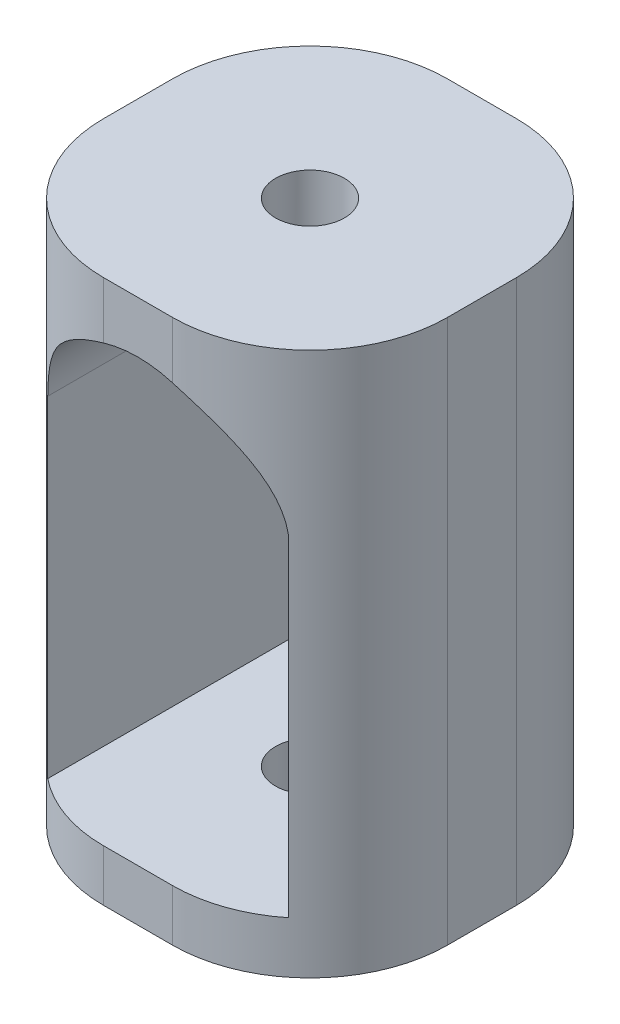
ISO-10303-21;
HEADER;
FILE_DESCRIPTION(('STEP AP214'),'2;1');
FILE_NAME('part.step','',(''),(''),'','','');
FILE_SCHEMA(('AUTOMOTIVE_DESIGN { 1 0 10303 214 1 1 1 1 }'));
ENDSEC;
DATA;
#1=APPLICATION_CONTEXT('core data for automotive mechanical design processes');
#2=APPLICATION_PROTOCOL_DEFINITION('international standard','automotive_design',2000,#1);
#3=PRODUCT_CONTEXT('',#1,'mechanical');
#4=PRODUCT('Part','Part','',(#3));
#5=PRODUCT_RELATED_PRODUCT_CATEGORY('part','',(#4));
#6=PRODUCT_DEFINITION_FORMATION('','',#4);
#7=PRODUCT_DEFINITION_CONTEXT('part definition',#1,'design');
#8=PRODUCT_DEFINITION('design','',#6,#7);
#9=PRODUCT_DEFINITION_SHAPE('','',#8);
#10=(LENGTH_UNIT() NAMED_UNIT(*) SI_UNIT(.MILLI.,.METRE.));
#11=(NAMED_UNIT(*) PLANE_ANGLE_UNIT() SI_UNIT($,.RADIAN.));
#12=(NAMED_UNIT(*) SI_UNIT($,.STERADIAN.) SOLID_ANGLE_UNIT());
#13=UNCERTAINTY_MEASURE_WITH_UNIT(LENGTH_MEASURE(1.E-05),#10,'distance_accuracy_value','');
#14=(GEOMETRIC_REPRESENTATION_CONTEXT(3) GLOBAL_UNCERTAINTY_ASSIGNED_CONTEXT((#13)) GLOBAL_UNIT_ASSIGNED_CONTEXT((#10,
#11,#12)) REPRESENTATION_CONTEXT('',''));
#15=CARTESIAN_POINT('',(0.,0.,0.));
#16=DIRECTION('',(0.,0.,1.));
#17=DIRECTION('',(1.,0.,0.));
#18=AXIS2_PLACEMENT_3D('',#15,#16,#17);
#19=CARTESIAN_POINT('',(0.,30.,20.));
#20=DIRECTION('',(0.,0.,-1.));
#21=DIRECTION('',(-1.,0.,0.));
#22=AXIS2_PLACEMENT_3D('',#19,#20,#21);
#23=PLANE('',#22);
#24=DIRECTION('',(1.,0.,0.));
#25=VECTOR('',#24,1.);
#26=CARTESIAN_POINT('',(0.,30.,20.));
#27=LINE('',#26,#25);
#28=CARTESIAN_POINT('',(-12.,30.,20.));
#29=VERTEX_POINT('',#28);
#30=CARTESIAN_POINT('',(-8.,30.,20.));
#31=VERTEX_POINT('',#30);
#32=EDGE_CURVE('E177',#29,#31,#27,.T.);
#33=ORIENTED_EDGE('',*,*,#32,.F.);
#34=DIRECTION('',(0.,-1.,0.));
#35=VECTOR('',#34,1.);
#36=CARTESIAN_POINT('',(-12.,30.,20.));
#37=LINE('',#36,#35);
#38=CARTESIAN_POINT('',(-12.,26.7096437297509,20.));
#39=VERTEX_POINT('',#38);
#40=EDGE_CURVE('E11',#29,#39,#37,.T.);
#41=ORIENTED_EDGE('',*,*,#40,.T.);
#42=CARTESIAN_POINT('',(-9.99999999999999,19.9667322834646,20.));
#43=DIRECTION('',(0.,0.,1.));
#44=DIRECTION('',(-1.,0.,0.));
#45=AXIS2_PLACEMENT_3D('',#42,#43,#44);
#46=CIRCLE('',#45,7.03326771653543);
#47=CARTESIAN_POINT('',(-8.,26.7096437297509,20.));
#48=VERTEX_POINT('',#47);
#49=EDGE_CURVE('E301',#48,#39,#46,.T.);
#50=ORIENTED_EDGE('',*,*,#49,.F.);
#51=DIRECTION('',(0.,-1.,0.));
#52=VECTOR('',#51,1.);
#53=CARTESIAN_POINT('',(-8.,30.,20.));
#54=LINE('',#53,#52);
#55=EDGE_CURVE('E52',#48,#31,#54,.F.);
#56=ORIENTED_EDGE('',*,*,#55,.T.);
#57=EDGE_LOOP('',(#33,#41,#50,#56));
#58=FACE_BOUND('',#57,.T.);
#59=ADVANCED_FACE('F36',(#58),#23,.F.);
#60=CARTESIAN_POINT('',(0.,30.,0.));
#61=DIRECTION('',(0.,0.,1.));
#62=DIRECTION('',(1.,0.,0.));
#63=AXIS2_PLACEMENT_3D('',#60,#61,#62);
#64=PLANE('',#63);
#65=DIRECTION('',(1.,0.,0.));
#66=VECTOR('',#65,1.);
#67=CARTESIAN_POINT('',(-20.,-1.6,0.));
#68=LINE('',#67,#66);
#69=CARTESIAN_POINT('',(-12.,-1.6,0.));
#70=VERTEX_POINT('',#69);
#71=CARTESIAN_POINT('',(-8.,-1.6,0.));
#72=VERTEX_POINT('',#71);
#73=EDGE_CURVE('E354',#70,#72,#68,.T.);
#74=ORIENTED_EDGE('',*,*,#73,.F.);
#75=DIRECTION('',(0.,-1.,0.));
#76=VECTOR('',#75,1.);
#77=CARTESIAN_POINT('',(-12.,30.,0.));
#78=LINE('',#77,#76);
#79=CARTESIAN_POINT('',(-12.,1.4,0.));
#80=VERTEX_POINT('',#79);
#81=EDGE_CURVE('E195',#70,#80,#78,.F.);
#82=ORIENTED_EDGE('',*,*,#81,.T.);
#83=DIRECTION('',(-1.,0.,0.));
#84=VECTOR('',#83,1.);
#85=CARTESIAN_POINT('',(-17.,1.4,0.));
#86=LINE('',#85,#84);
#87=CARTESIAN_POINT('',(-8.,1.4,0.));
#88=VERTEX_POINT('',#87);
#89=EDGE_CURVE('E339',#88,#80,#86,.T.);
#90=ORIENTED_EDGE('',*,*,#89,.F.);
#91=DIRECTION('',(0.,-1.,0.));
#92=VECTOR('',#91,1.);
#93=CARTESIAN_POINT('',(-8.,30.,0.));
#94=LINE('',#93,#92);
#95=EDGE_CURVE('E188',#88,#72,#94,.T.);
#96=ORIENTED_EDGE('',*,*,#95,.T.);
#97=EDGE_LOOP('',(#74,#82,#90,#96));
#98=FACE_BOUND('',#97,.T.);
#99=ADVANCED_FACE('F272',(#98),#64,.F.);
#100=CARTESIAN_POINT('',(0.,30.,0.));
#101=DIRECTION('',(-1.,0.,0.));
#102=DIRECTION('',(0.,0.,1.));
#103=AXIS2_PLACEMENT_3D('',#100,#101,#102);
#104=PLANE('',#103);
#105=DIRECTION('',(0.,0.,1.));
#106=VECTOR('',#105,1.);
#107=CARTESIAN_POINT('',(0.,-1.6,0.));
#108=LINE('',#107,#106);
#109=CARTESIAN_POINT('',(0.,-1.6,8.));
#110=VERTEX_POINT('',#109);
#111=CARTESIAN_POINT('',(0.,-1.6,12.));
#112=VERTEX_POINT('',#111);
#113=EDGE_CURVE('E351',#110,#112,#108,.T.);
#114=ORIENTED_EDGE('',*,*,#113,.F.);
#115=DIRECTION('',(0.,-1.,0.));
#116=VECTOR('',#115,1.);
#117=CARTESIAN_POINT('',(0.,30.,8.));
#118=LINE('',#117,#116);
#119=CARTESIAN_POINT('',(0.,30.,8.));
#120=VERTEX_POINT('',#119);
#121=EDGE_CURVE('E308',#110,#120,#118,.F.);
#122=ORIENTED_EDGE('',*,*,#121,.T.);
#123=DIRECTION('',(0.,0.,-1.));
#124=VECTOR('',#123,1.);
#125=CARTESIAN_POINT('',(0.,30.,0.));
#126=LINE('',#125,#124);
#127=CARTESIAN_POINT('',(0.,30.,12.));
#128=VERTEX_POINT('',#127);
#129=EDGE_CURVE('E344',#128,#120,#126,.T.);
#130=ORIENTED_EDGE('',*,*,#129,.F.);
#131=DIRECTION('',(0.,-1.,0.));
#132=VECTOR('',#131,1.);
#133=CARTESIAN_POINT('',(0.,30.,12.));
#134=LINE('',#133,#132);
#135=EDGE_CURVE('E310',#128,#112,#134,.T.);
#136=ORIENTED_EDGE('',*,*,#135,.T.);
#137=EDGE_LOOP('',(#114,#122,#130,#136));
#138=FACE_BOUND('',#137,.T.);
#139=ADVANCED_FACE('F278',(#138),#104,.F.);
#140=CARTESIAN_POINT('',(-9.99999999999999,19.9667322834646,0.));
#141=DIRECTION('',(0.,0.,1.));
#142=DIRECTION('',(1.,0.,0.));
#143=AXIS2_PLACEMENT_3D('',#140,#141,#142);
#144=CIRCLE('',#143,7.03326771653543);
#145=CARTESIAN_POINT('',(-12.,26.7096437297509,0.));
#146=VERTEX_POINT('',#145);
#147=CARTESIAN_POINT('',(-8.,26.7096437297509,0.));
#148=VERTEX_POINT('',#147);
#149=EDGE_CURVE('E330',#146,#148,#144,.F.);
#150=ORIENTED_EDGE('',*,*,#149,.F.);
#151=DIRECTION('',(0.,-1.,0.));
#152=VECTOR('',#151,1.);
#153=CARTESIAN_POINT('',(-12.,30.,0.));
#154=LINE('',#153,#152);
#155=CARTESIAN_POINT('',(-12.,30.,0.));
#156=VERTEX_POINT('',#155);
#157=EDGE_CURVE('E193',#146,#156,#154,.F.);
#158=ORIENTED_EDGE('',*,*,#157,.T.);
#159=DIRECTION('',(-1.,0.,0.));
#160=VECTOR('',#159,1.);
#161=CARTESIAN_POINT('',(0.,30.,0.));
#162=LINE('',#161,#160);
#163=CARTESIAN_POINT('',(-8.,30.,0.));
#164=VERTEX_POINT('',#163);
#165=EDGE_CURVE('E343',#164,#156,#162,.T.);
#166=ORIENTED_EDGE('',*,*,#165,.F.);
#167=DIRECTION('',(0.,-1.,0.));
#168=VECTOR('',#167,1.);
#169=CARTESIAN_POINT('',(-8.,30.,0.));
#170=LINE('',#169,#168);
#171=EDGE_CURVE('E190',#164,#148,#170,.T.);
#172=ORIENTED_EDGE('',*,*,#171,.T.);
#173=EDGE_LOOP('',(#150,#158,#166,#172));
#174=FACE_BOUND('',#173,.T.);
#175=ADVANCED_FACE('F281',(#174),#64,.F.);
#176=CARTESIAN_POINT('',(-20.,30.,0.));
#177=DIRECTION('',(1.,0.,0.));
#178=DIRECTION('',(0.,0.,-1.));
#179=AXIS2_PLACEMENT_3D('',#176,#177,#178);
#180=PLANE('',#179);
#181=DIRECTION('',(0.,0.,1.));
#182=VECTOR('',#181,1.);
#183=CARTESIAN_POINT('',(-20.,30.,0.));
#184=LINE('',#183,#182);
#185=CARTESIAN_POINT('',(-20.,30.,8.00000000000001));
#186=VERTEX_POINT('',#185);
#187=CARTESIAN_POINT('',(-20.,30.,12.));
#188=VERTEX_POINT('',#187);
#189=EDGE_CURVE('E180',#186,#188,#184,.T.);
#190=ORIENTED_EDGE('',*,*,#189,.F.);
#191=DIRECTION('',(0.,-1.,0.));
#192=VECTOR('',#191,1.);
#193=CARTESIAN_POINT('',(-20.,30.,8.00000000000001));
#194=LINE('',#193,#192);
#195=CARTESIAN_POINT('',(-20.,-1.6,8.00000000000001));
#196=VERTEX_POINT('',#195);
#197=EDGE_CURVE('E172',#186,#196,#194,.T.);
#198=ORIENTED_EDGE('',*,*,#197,.T.);
#199=DIRECTION('',(0.,0.,-1.));
#200=VECTOR('',#199,1.);
#201=CARTESIAN_POINT('',(-20.,-1.6,20.));
#202=LINE('',#201,#200);
#203=CARTESIAN_POINT('',(-20.,-1.6,12.));
#204=VERTEX_POINT('',#203);
#205=EDGE_CURVE('E157',#204,#196,#202,.T.);
#206=ORIENTED_EDGE('',*,*,#205,.F.);
#207=DIRECTION('',(0.,-1.,0.));
#208=VECTOR('',#207,1.);
#209=CARTESIAN_POINT('',(-20.,30.,12.));
#210=LINE('',#209,#208);
#211=EDGE_CURVE('E170',#204,#188,#210,.F.);
#212=ORIENTED_EDGE('',*,*,#211,.T.);
#213=EDGE_LOOP('',(#190,#198,#206,#212));
#214=FACE_BOUND('',#213,.T.);
#215=ADVANCED_FACE('F169',(#214),#180,.F.);
#216=DIRECTION('',(1.,0.,0.));
#217=VECTOR('',#216,1.);
#218=CARTESIAN_POINT('',(-17.,1.4,20.));
#219=LINE('',#218,#217);
#220=CARTESIAN_POINT('',(-12.,1.4,20.));
#221=VERTEX_POINT('',#220);
#222=CARTESIAN_POINT('',(-8.,1.4,20.));
#223=VERTEX_POINT('',#222);
#224=EDGE_CURVE('E295',#221,#223,#219,.T.);
#225=ORIENTED_EDGE('',*,*,#224,.F.);
#226=DIRECTION('',(0.,-1.,0.));
#227=VECTOR('',#226,1.);
#228=CARTESIAN_POINT('',(-12.,30.,20.));
#229=LINE('',#228,#227);
#230=CARTESIAN_POINT('',(-12.,-1.6,20.));
#231=VERTEX_POINT('',#230);
#232=EDGE_CURVE('E45',#221,#231,#229,.T.);
#233=ORIENTED_EDGE('',*,*,#232,.T.);
#234=DIRECTION('',(-1.,0.,0.));
#235=VECTOR('',#234,1.);
#236=CARTESIAN_POINT('',(0.,-1.6,20.));
#237=LINE('',#236,#235);
#238=CARTESIAN_POINT('',(-8.,-1.6,20.));
#239=VERTEX_POINT('',#238);
#240=EDGE_CURVE('E159',#239,#231,#237,.T.);
#241=ORIENTED_EDGE('',*,*,#240,.F.);
#242=DIRECTION('',(0.,-1.,0.));
#243=VECTOR('',#242,1.);
#244=CARTESIAN_POINT('',(-8.,30.,20.));
#245=LINE('',#244,#243);
#246=EDGE_CURVE('E297',#239,#223,#245,.F.);
#247=ORIENTED_EDGE('',*,*,#246,.T.);
#248=EDGE_LOOP('',(#225,#233,#241,#247));
#249=FACE_BOUND('',#248,.T.);
#250=ADVANCED_FACE('F274',(#249),#23,.F.);
#251=CARTESIAN_POINT('',(0.,30.,0.));
#252=DIRECTION('',(0.,-1.,0.));
#253=DIRECTION('',(0.,0.,-1.));
#254=AXIS2_PLACEMENT_3D('',#251,#252,#253);
#255=PLANE('',#254);
#256=CARTESIAN_POINT('',(-10.,30.,10.));
#257=DIRECTION('',(0.,1.,0.));
#258=DIRECTION('',(0.,0.,1.));
#259=AXIS2_PLACEMENT_3D('',#256,#257,#258);
#260=CIRCLE('',#259,2.);
#261=CARTESIAN_POINT('',(-10.,30.,12.));
#262=VERTEX_POINT('',#261);
#263=EDGE_CURVE('E173',#262,#262,#260,.T.);
#264=ORIENTED_EDGE('',*,*,#263,.F.);
#265=EDGE_LOOP('',(#264));
#266=FACE_BOUND('',#265,.T.);
#267=ORIENTED_EDGE('',*,*,#165,.T.);
#268=CARTESIAN_POINT('',(-12.,30.,8.));
#269=DIRECTION('',(0.,-1.,0.));
#270=DIRECTION('',(0.,0.,-1.));
#271=AXIS2_PLACEMENT_3D('',#268,#269,#270);
#272=CIRCLE('',#271,8.);
#273=EDGE_CURVE('E317',#156,#186,#272,.F.);
#274=ORIENTED_EDGE('',*,*,#273,.T.);
#275=ORIENTED_EDGE('',*,*,#189,.T.);
#276=CARTESIAN_POINT('',(-12.,30.,12.));
#277=DIRECTION('',(0.,-1.,0.));
#278=DIRECTION('',(0.,0.,-1.));
#279=AXIS2_PLACEMENT_3D('',#276,#277,#278);
#280=CIRCLE('',#279,8.);
#281=EDGE_CURVE('E59',#188,#29,#280,.F.);
#282=ORIENTED_EDGE('',*,*,#281,.T.);
#283=ORIENTED_EDGE('',*,*,#32,.T.);
#284=CARTESIAN_POINT('',(-8.,30.,12.));
#285=DIRECTION('',(0.,-1.,0.));
#286=DIRECTION('',(0.,0.,-1.));
#287=AXIS2_PLACEMENT_3D('',#284,#285,#286);
#288=CIRCLE('',#287,8.);
#289=EDGE_CURVE('E321',#31,#128,#288,.F.);
#290=ORIENTED_EDGE('',*,*,#289,.T.);
#291=ORIENTED_EDGE('',*,*,#129,.T.);
#292=CARTESIAN_POINT('',(-8.,30.,8.));
#293=DIRECTION('',(0.,-1.,0.));
#294=DIRECTION('',(0.,0.,-1.));
#295=AXIS2_PLACEMENT_3D('',#292,#293,#294);
#296=CIRCLE('',#295,8.);
#297=EDGE_CURVE('E319',#120,#164,#296,.F.);
#298=ORIENTED_EDGE('',*,*,#297,.T.);
#299=EDGE_LOOP('',(#267,#274,#275,#282,#283,#290,#291,#298));
#300=FACE_BOUND('',#299,.T.);
#301=ADVANCED_FACE('F285',(#266,#300),#255,.F.);
#302=CARTESIAN_POINT('',(-10.,-5.65685424949237,10.));
#303=DIRECTION('',(0.,1.,0.));
#304=DIRECTION('',(0.,0.,1.));
#305=AXIS2_PLACEMENT_3D('',#302,#303,#304);
#306=CYLINDRICAL_SURFACE('',#305,2.);
#307=CARTESIAN_POINT('',(-10.,27.,12.));
#308=CARTESIAN_POINT('',(-9.89002323008142,26.9999986631075,11.9999980075233));
#309=CARTESIAN_POINT('',(-9.78002592162839,26.9973954816544,11.9908985779632));
#310=CARTESIAN_POINT('',(-9.56321799753198,26.987264427822,11.9548170044332));
#311=CARTESIAN_POINT('',(-9.45640862820039,26.9797346551117,11.9278279598607));
#312=CARTESIAN_POINT('',(-9.24913611540734,26.9605784037967,11.8569290479218));
#313=CARTESIAN_POINT('',(-9.14866439573793,26.9489576078362,11.8130426439853));
#314=CARTESIAN_POINT('',(-8.95650615027241,26.9228368602517,11.7096866021266));
#315=CARTESIAN_POINT('',(-8.86482052124778,26.9083366151935,11.6502153758142));
#316=CARTESIAN_POINT('',(-8.6904473020364,26.8775901263815,11.515742785613));
#317=CARTESIAN_POINT('',(-8.60802123482704,26.8613109045998,11.4404098467961));
#318=CARTESIAN_POINT('',(-8.45678574443976,26.8290450635875,11.277059919695));
#319=CARTESIAN_POINT('',(-8.38797834089474,26.8130584880745,11.1890410534416));
#320=CARTESIAN_POINT('',(-8.2646063771881,26.7828448103766,11.0006657013812));
#321=CARTESIAN_POINT('',(-8.210352131222,26.7686590008082,10.9000987441837));
#322=CARTESIAN_POINT('',(-8.11962899780627,26.7441420959726,10.6908008408724));
#323=CARTESIAN_POINT('',(-8.08315632477708,26.733810180347,10.5820716381398));
#324=CARTESIAN_POINT('',(-8.02995796126352,26.7185130163898,10.3624536112242));
#325=CARTESIAN_POINT('',(-8.01275389121428,26.7134180292846,10.2516899338622));
#326=CARTESIAN_POINT('',(-7.99708835765661,26.7087848110498,10.0287403132745));
#327=CARTESIAN_POINT('',(-7.99862286408236,26.7092453850972,9.91655468105029));
#328=CARTESIAN_POINT('',(-8.02001324264566,26.7155557139696,9.69775889612626));
#329=CARTESIAN_POINT('',(-8.03927988224132,26.7212321381485,9.59108532678056));
#330=CARTESIAN_POINT('',(-8.09463961188774,26.7370555565261,9.38255142237268));
#331=CARTESIAN_POINT('',(-8.13073421023864,26.7472029514561,9.28069151966387));
#332=CARTESIAN_POINT('',(-8.21918124950723,26.7709700031349,9.08318967782017));
#333=CARTESIAN_POINT('',(-8.27173219430433,26.7846316705843,8.98764190474801));
#334=CARTESIAN_POINT('',(-8.39146201943593,26.8138666040608,8.80651876584053));
#335=CARTESIAN_POINT('',(-8.45864412919661,26.829440291782,8.72094560803835));
#336=CARTESIAN_POINT('',(-8.60869741037673,26.8614564626214,8.558846584584));
#337=CARTESIAN_POINT('',(-8.69206045788502,26.8779096803402,8.48277744798904));
#338=CARTESIAN_POINT('',(-8.87056372920384,26.9093131577785,8.34559849694791));
#339=CARTESIAN_POINT('',(-8.9657045515849,26.9242633410406,8.28448944327401));
#340=CARTESIAN_POINT('',(-9.16583323858741,26.951090201767,8.17872539103332));
#341=CARTESIAN_POINT('',(-9.27087234744961,26.9629495361282,8.13416266732732));
#342=CARTESIAN_POINT('',(-9.48736780524044,26.9821334806199,8.06346537750509));
#343=CARTESIAN_POINT('',(-9.59882254497401,26.9894592225144,8.03732621191386));
#344=CARTESIAN_POINT('',(-9.82109551722481,26.9985753275427,8.00495745100793));
#345=CARTESIAN_POINT('',(-9.93181654574889,27.0005379800175,7.99810794577314));
#346=CARTESIAN_POINT('',(-10.1528288044172,26.999207341095,8.00278775883733));
#347=CARTESIAN_POINT('',(-10.2631200840447,26.995914673891,8.014314894476));
#348=CARTESIAN_POINT('',(-10.4778637306722,26.9845554909429,8.05491576218522));
#349=CARTESIAN_POINT('',(-10.5823886593275,26.9765854270986,8.08363520742052));
#350=CARTESIAN_POINT('',(-10.7851205107687,26.9567840596273,8.15738638473844));
#351=CARTESIAN_POINT('',(-10.8833267043509,26.9449523113021,8.20241999556986));
#352=CARTESIAN_POINT('',(-11.0729762895559,26.9183472225837,8.30861396970989));
#353=CARTESIAN_POINT('',(-11.1642288380064,26.9035160967532,8.37010030226884));
#354=CARTESIAN_POINT('',(-11.3353353721032,26.8726215450002,8.50705183690263));
#355=CARTESIAN_POINT('',(-11.4151867823069,26.8565578419025,8.58252018860602));
#356=CARTESIAN_POINT('',(-11.5638986339781,26.8243601507454,8.74819854926337));
#357=CARTESIAN_POINT('',(-11.6323195071728,26.8082407266397,8.83880674240967));
#358=CARTESIAN_POINT('',(-11.7530058083766,26.7783184199433,9.03056600063466));
#359=CARTESIAN_POINT('',(-11.8052718089668,26.7645154552577,9.13171669188303));
#360=CARTESIAN_POINT('',(-11.8917821244985,26.7409501144299,9.34126247161521));
#361=CARTESIAN_POINT('',(-11.9261228031718,26.7311661943861,9.44961521812));
#362=CARTESIAN_POINT('',(-11.9759904325079,26.7167695563469,9.67088930099522));
#363=CARTESIAN_POINT('',(-11.9915230168203,26.7121552898994,9.78380925885609));
#364=CARTESIAN_POINT('',(-12.0029780375576,26.7087619920525,10.0064788541373));
#365=CARTESIAN_POINT('',(-11.9996119542711,26.7097712404667,10.1161891744899));
#366=CARTESIAN_POINT('',(-11.97504039434,26.7170086289732,10.3334092104711));
#367=CARTESIAN_POINT('',(-11.9538355024914,26.7232365979843,10.4409189981197));
#368=CARTESIAN_POINT('',(-11.8946258080383,26.7400751583448,10.6496527030681));
#369=CARTESIAN_POINT('',(-11.8567912293735,26.7506412733695,10.7509287531423));
#370=CARTESIAN_POINT('',(-11.7655278013715,26.7749616071379,10.9457753581468));
#371=CARTESIAN_POINT('',(-11.7120962139436,26.7887163855716,11.0393445564204));
#372=CARTESIAN_POINT('',(-11.589081428397,26.8184327166438,11.2194690177022));
#373=CARTESIAN_POINT('',(-11.519022148243,26.8344522440368,11.305689600017));
#374=CARTESIAN_POINT('',(-11.3656209278573,26.866592117762,11.465381370765));
#375=CARTESIAN_POINT('',(-11.2822756567218,26.8827124884001,11.5388493523455));
#376=CARTESIAN_POINT('',(-11.1021226361289,26.9137268136065,11.6727939260145));
#377=CARTESIAN_POINT('',(-11.0050273277383,26.928579353576,11.7328942552712));
#378=CARTESIAN_POINT('',(-10.8016886937534,26.9549101720236,11.8358278175104));
#379=CARTESIAN_POINT('',(-10.6954504717589,26.9663903173876,11.8786706087937));
#380=CARTESIAN_POINT('',(-10.4915579313954,26.9834447624858,11.941178046826));
#381=CARTESIAN_POINT('',(-10.3946635035181,26.9896046661105,11.9631807601655));
#382=CARTESIAN_POINT('',(-10.1985180879406,26.9978826235379,11.9925916802436));
#383=CARTESIAN_POINT('',(-10.0992674106072,27.0000012067081,12.0000017984526));
#384=CARTESIAN_POINT('',(-10.,27.,12.));
#385=B_SPLINE_CURVE_WITH_KNOTS('',3,(#307,#308,#309,#310,#311,#312,#313,#314,#315,#316,#317,
#318,#319,#320,#321,#322,#323,#324,#325,#326,#327,#328,#329,#330,#331,#332,#333,#334,#335,#336,
#337,#338,#339,#340,#341,#342,#343,#344,#345,#346,#347,#348,#349,#350,#351,#352,#353,#354,#355,
#356,#357,#358,#359,#360,#361,#362,#363,#364,#365,#366,#367,#368,#369,#370,#371,#372,#373,#374,
#375,#376,#377,#378,#379,#380,#381,#382,#383,#384),.UNSPECIFIED.,.T.,.F.,(4,2,2,2,2,2,2,2,2,2,2,
2,2,2,2,2,2,2,2,2,2,2,2,2,2,2,2,2,2,2,2,2,2,2,2,2,2,2,4),(0.,0.329565966965897,
0.659259132212762,0.988496131803603,1.31776669997362,1.65476115896688,1.991805556485,
2.33554985652034,2.67922094367102,3.0141563141953,3.34901965215013,3.67314232075217,
3.99729404625244,4.32551710538069,4.65381268425456,4.99435811269182,5.33492085545324,
5.67735528159003,6.01970418803598,6.35091813739709,6.68209275020667,7.00666696959905,
7.33127857903547,7.66287073027204,7.99453766789984,8.33694314664945,8.67933648804522,
9.0198697108806,9.360300907442,9.68800390563016,10.0156961614006,10.3401095094706,
10.6645798433333,10.9997902456401,11.3350848204215,11.678873474546,12.0224714543916,
12.3199837959884,12.6174571641296),.UNSPECIFIED.);
#386=CARTESIAN_POINT('',(-10.,27.,12.));
#387=VERTEX_POINT('',#386);
#388=EDGE_CURVE('E235',#387,#387,#385,.T.);
#389=ORIENTED_EDGE('',*,*,#388,.F.);
#390=EDGE_LOOP('',(#389));
#391=FACE_BOUND('',#390,.T.);
#392=ORIENTED_EDGE('',*,*,#263,.T.);
#393=EDGE_LOOP('',(#392));
#394=FACE_BOUND('',#393,.T.);
#395=ADVANCED_FACE('F291',(#391,#394),#306,.F.);
#396=CARTESIAN_POINT('',(-10.,1.4,10.));
#397=DIRECTION('',(0.,-1.,0.));
#398=DIRECTION('',(1.,0.,0.));
#399=AXIS2_PLACEMENT_3D('',#396,#397,#398);
#400=CIRCLE('',#399,2.);
#401=CARTESIAN_POINT('',(-8.,1.4,10.));
#402=VERTEX_POINT('',#401);
#403=EDGE_CURVE('E361',#402,#402,#400,.T.);
#404=ORIENTED_EDGE('',*,*,#403,.F.);
#405=EDGE_LOOP('',(#404));
#406=FACE_BOUND('',#405,.T.);
#407=CARTESIAN_POINT('',(-10.,-1.6,10.));
#408=DIRECTION('',(0.,-1.,0.));
#409=DIRECTION('',(0.,0.,-1.));
#410=AXIS2_PLACEMENT_3D('',#407,#408,#409);
#411=CIRCLE('',#410,2.);
#412=CARTESIAN_POINT('',(-10.,-1.6,8.));
#413=VERTEX_POINT('',#412);
#414=EDGE_CURVE('E356',#413,#413,#411,.T.);
#415=ORIENTED_EDGE('',*,*,#414,.T.);
#416=EDGE_LOOP('',(#415));
#417=FACE_BOUND('',#416,.T.);
#418=ADVANCED_FACE('F442',(#406,#417),#306,.F.);
#419=CARTESIAN_POINT('',(0.,-1.6,0.));
#420=DIRECTION('',(0.,-1.,0.));
#421=DIRECTION('',(0.,0.,-1.));
#422=AXIS2_PLACEMENT_3D('',#419,#420,#421);
#423=PLANE('',#422);
#424=ORIENTED_EDGE('',*,*,#205,.T.);
#425=CARTESIAN_POINT('',(-12.,-1.6,8.));
#426=DIRECTION('',(0.,-1.,0.));
#427=DIRECTION('',(0.,0.,-1.));
#428=AXIS2_PLACEMENT_3D('',#425,#426,#427);
#429=CIRCLE('',#428,8.);
#430=EDGE_CURVE('E186',#196,#70,#429,.T.);
#431=ORIENTED_EDGE('',*,*,#430,.T.);
#432=ORIENTED_EDGE('',*,*,#73,.T.);
#433=CARTESIAN_POINT('',(-8.,-1.6,8.));
#434=DIRECTION('',(0.,-1.,0.));
#435=DIRECTION('',(0.,0.,-1.));
#436=AXIS2_PLACEMENT_3D('',#433,#434,#435);
#437=CIRCLE('',#436,8.);
#438=EDGE_CURVE('E163',#72,#110,#437,.T.);
#439=ORIENTED_EDGE('',*,*,#438,.T.);
#440=ORIENTED_EDGE('',*,*,#113,.T.);
#441=CARTESIAN_POINT('',(-8.,-1.6,12.));
#442=DIRECTION('',(0.,-1.,0.));
#443=DIRECTION('',(0.,0.,-1.));
#444=AXIS2_PLACEMENT_3D('',#441,#442,#443);
#445=CIRCLE('',#444,8.);
#446=EDGE_CURVE('E164',#112,#239,#445,.T.);
#447=ORIENTED_EDGE('',*,*,#446,.T.);
#448=ORIENTED_EDGE('',*,*,#240,.T.);
#449=CARTESIAN_POINT('',(-12.,-1.6,12.));
#450=DIRECTION('',(0.,-1.,0.));
#451=DIRECTION('',(0.,0.,-1.));
#452=AXIS2_PLACEMENT_3D('',#449,#450,#451);
#453=CIRCLE('',#452,8.);
#454=EDGE_CURVE('E153',#231,#204,#453,.T.);
#455=ORIENTED_EDGE('',*,*,#454,.T.);
#456=EDGE_LOOP('',(#424,#431,#432,#439,#440,#447,#448,#455));
#457=FACE_BOUND('',#456,.T.);
#458=ORIENTED_EDGE('',*,*,#414,.F.);
#459=EDGE_LOOP('',(#458));
#460=FACE_BOUND('',#459,.T.);
#461=ADVANCED_FACE('F155',(#457,#460),#423,.T.);
#462=CARTESIAN_POINT('',(-9.99999999999999,19.9667322834646,-0.001000000000001));
#463=DIRECTION('',(0.,0.,1.));
#464=DIRECTION('',(1.,0.,0.));
#465=AXIS2_PLACEMENT_3D('',#462,#463,#464);
#466=CYLINDRICAL_SURFACE('',#465,7.03326771653543);
#467=ORIENTED_EDGE('',*,*,#388,.T.);
#468=EDGE_LOOP('',(#467));
#469=FACE_BOUND('',#468,.T.);
#470=DIRECTION('',(0.,0.,1.));
#471=VECTOR('',#470,1.);
#472=CARTESIAN_POINT('',(-17.,20.65,-0.001000000000001));
#473=LINE('',#472,#471);
#474=CARTESIAN_POINT('',(-17.,20.65,1.7550020016016));
#475=VERTEX_POINT('',#474);
#476=CARTESIAN_POINT('',(-17.,20.65,18.2449979983984));
#477=VERTEX_POINT('',#476);
#478=EDGE_CURVE('E300',#475,#477,#473,.T.);
#479=ORIENTED_EDGE('',*,*,#478,.F.);
#480=CARTESIAN_POINT('',(-17.,20.65,1.7550020016016));
#481=CARTESIAN_POINT('',(-16.9907901381987,20.7443669206953,1.74763219581577));
#482=CARTESIAN_POINT('',(-16.9796824046338,20.8384120172625,1.73876797918123));
#483=CARTESIAN_POINT('',(-16.9537372435456,21.025657635842,1.7182190616562));
#484=CARTESIAN_POINT('',(-16.9389005595765,21.118858322396,1.7065349230778));
#485=CARTESIAN_POINT('',(-16.8889506849867,21.3966083083012,1.6675474710738));
#486=CARTESIAN_POINT('',(-16.8483633601186,21.579653375386,1.63628081898735));
#487=CARTESIAN_POINT('',(-16.7536448323751,21.9388905193763,1.56522555337328));
#488=CARTESIAN_POINT('',(-16.699619016655,22.115124137749,1.52550358219683));
#489=CARTESIAN_POINT('',(-16.5785319541153,22.4614133230096,1.43931653447523));
#490=CARTESIAN_POINT('',(-16.5114653204781,22.6314663022663,1.39284867339792));
#491=CARTESIAN_POINT('',(-16.3653693570682,22.9636719637511,1.29543443701972));
#492=CARTESIAN_POINT('',(-16.2864162677308,23.1258668614721,1.24451741472772));
#493=CARTESIAN_POINT('',(-16.1167934650269,23.4429430175103,1.13982739766511));
#494=CARTESIAN_POINT('',(-16.0261251162994,23.5978251247851,1.0860547359595));
#495=CARTESIAN_POINT('',(-15.7363757099488,24.052078515237,0.922668751695562));
#496=CARTESIAN_POINT('',(-15.519964501509,24.3401197124439,0.811280778777966));
#497=CARTESIAN_POINT('',(-15.1466690491922,24.7647307341158,0.643326731925062));
#498=CARTESIAN_POINT('',(-15.0042394466768,24.9131464391662,0.583794793198902));
#499=CARTESIAN_POINT('',(-14.7057580288292,25.1979095964715,0.469769885360674));
#500=CARTESIAN_POINT('',(-14.5497035474823,25.3342546762774,0.415277906745492));
#501=CARTESIAN_POINT('',(-14.2252717499544,25.5931731565468,0.313847483809736));
#502=CARTESIAN_POINT('',(-14.0569432043501,25.7157966285237,0.266881286629689));
#503=CARTESIAN_POINT('',(-13.7084774498693,25.9465068046568,0.182504343117259));
#504=CARTESIAN_POINT('',(-13.5283470816619,26.054601820956,0.145088121860052));
#505=CARTESIAN_POINT('',(-13.1313182872629,26.2690656527866,0.0774958859919697));
#506=CARTESIAN_POINT('',(-12.9128094882531,26.3730587617102,0.0490753679929574));
#507=CARTESIAN_POINT('',(-12.5765837484328,26.5121806109274,0.0200060241492906));
#508=CARTESIAN_POINT('',(-12.4628775346363,26.555808935187,0.0125753623466045));
#509=CARTESIAN_POINT('',(-12.2330983453412,26.6371891693491,0.00256875497018994));
#510=CARTESIAN_POINT('',(-12.1170240141853,26.674937600036,-4.32624152401907E-06));
#511=CARTESIAN_POINT('',(-12.,26.7096437297509,0.));
#512=B_SPLINE_CURVE_WITH_KNOTS('',3,(#480,#481,#482,#483,#484,#485,#486,#487,#488,#489,#490,
#491,#492,#493,#494,#495,#496,#497,#498,#499,#500,#501,#502,#503,#504,#505,#506,#507,#508,#509,
#510,#511),.UNSPECIFIED.,.F.,.F.,(4,2,2,2,2,2,2,2,2,2,2,2,2,2,2,4),(0.,0.285236709925314,
0.570416588589277,1.13972897068423,1.70471018218991,2.26992527021324,2.8316583971376,
3.39332615009225,4.5198297198619,5.16160939873961,5.80351493893281,6.44299595442297,
7.0821095329136,7.81100568195729,8.17682413166927,8.54285822568342),.UNSPECIFIED.);
#513=EDGE_CURVE('E251',#475,#146,#512,.T.);
#514=ORIENTED_EDGE('',*,*,#513,.T.);
#515=ORIENTED_EDGE('',*,*,#149,.T.);
#516=CARTESIAN_POINT('',(-8.,26.7096437297509,0.));
#517=CARTESIAN_POINT('',(-7.82790750095293,26.6586420521808,-3.69845611892971E-05));
#518=CARTESIAN_POINT('',(-7.6578633166204,26.600998701814,0.00555079610763034));
#519=CARTESIAN_POINT('',(-7.32340367237638,26.47323214642,0.0269139061323545));
#520=CARTESIAN_POINT('',(-7.15898191849778,26.4031234798252,0.0426774231609759));
#521=CARTESIAN_POINT('',(-6.8382956335285,26.251769616885,0.0831579106889546));
#522=CARTESIAN_POINT('',(-6.68197256862563,26.1706266406704,0.107795773737431));
#523=CARTESIAN_POINT('',(-6.37688135958538,25.9975389973982,0.164850355113498));
#524=CARTESIAN_POINT('',(-6.22811521916015,25.9055914867189,0.197269123631413));
#525=CARTESIAN_POINT('',(-5.93956170307394,25.7121417743844,0.268468734424873));
#526=CARTESIAN_POINT('',(-5.799736683026,25.6106847741781,0.30722007083477));
#527=CARTESIAN_POINT('',(-5.52889753554196,25.3986470080865,0.389893216739203));
#528=CARTESIAN_POINT('',(-5.39788287325492,25.2880667969537,0.433814711922538));
#529=CARTESIAN_POINT('',(-5.01775278310111,24.9428159867471,0.571751776408119));
#530=CARTESIAN_POINT('',(-4.78231220321399,24.6951490359863,0.671740081196446));
#531=CARTESIAN_POINT('',(-4.44469148277114,24.2844049879582,0.832150254271232));
#532=CARTESIAN_POINT('',(-4.32908707221492,24.1313828738045,0.890868021661632));
#533=CARTESIAN_POINT('',(-4.11067526286117,23.8163392524564,1.00796867696572));
#534=CARTESIAN_POINT('',(-4.00786976432408,23.6543164140725,1.06635151392757));
#535=CARTESIAN_POINT('',(-3.71986052297413,23.1562879411324,1.23759761243479));
#536=CARTESIAN_POINT('',(-3.55415433612056,22.8072164438434,1.34701796898486));
#537=CARTESIAN_POINT('',(-3.36413510107674,22.3023548454364,1.47979862643788));
#538=CARTESIAN_POINT('',(-3.31520910851441,22.1584668165705,1.51495773514041));
#539=CARTESIAN_POINT('',(-3.22651439368785,21.866722669994,1.57996552288339));
#540=CARTESIAN_POINT('',(-3.18674230977028,21.718868031313,1.60981615047569));
#541=CARTESIAN_POINT('',(-3.11658401535323,21.4190543249252,1.6632627750904));
#542=CARTESIAN_POINT('',(-3.08624380141935,21.2670789548277,1.68682804336031));
#543=CARTESIAN_POINT('',(-3.03553341048615,20.9603671939422,1.72664287467131));
#544=CARTESIAN_POINT('',(-3.01517395236904,20.8056280189253,1.74288457103185));
#545=CARTESIAN_POINT('',(-2.99999999999999,20.65,1.75500200160161));
#546=B_SPLINE_CURVE_WITH_KNOTS('',3,(#516,#517,#518,#519,#520,#521,#522,#523,#524,#525,#526,
#527,#528,#529,#530,#531,#532,#533,#534,#535,#536,#537,#538,#539,#540,#541,#542,#543,#544,#545),
.UNSPECIFIED.,.F.,.F.,(4,2,2,2,2,2,2,2,2,2,2,2,2,2,4),(0.,0.538140775299142,1.07565797984196,
1.6084976625153,2.14147789751517,2.67204209775132,3.20257405986144,4.26642953948944,
4.86761527780924,5.4688901682785,6.66697295649567,7.13466735492764,7.60218972367551,
8.0719575411427,8.5422287688323),.UNSPECIFIED.);
#547=CARTESIAN_POINT('',(-2.99999999999999,20.65,1.75500200160161));
#548=VERTEX_POINT('',#547);
#549=EDGE_CURVE('E245',#148,#548,#546,.T.);
#550=ORIENTED_EDGE('',*,*,#549,.T.);
#551=DIRECTION('',(0.,0.,1.));
#552=VECTOR('',#551,1.);
#553=CARTESIAN_POINT('',(-2.99999999999999,20.65,-0.001000000000001));
#554=LINE('',#553,#552);
#555=CARTESIAN_POINT('',(-2.99999999999999,20.65,18.2449979983984));
#556=VERTEX_POINT('',#555);
#557=EDGE_CURVE('E364',#548,#556,#554,.T.);
#558=ORIENTED_EDGE('',*,*,#557,.T.);
#559=CARTESIAN_POINT('',(-2.99999999999999,20.65,18.2449979983984));
#560=CARTESIAN_POINT('',(-3.00920986180125,20.7443669206953,18.2523678041842));
#561=CARTESIAN_POINT('',(-3.02031759536613,20.8384120172625,18.2612320208188));
#562=CARTESIAN_POINT('',(-3.0462627564544,21.025657635842,18.2817809383438));
#563=CARTESIAN_POINT('',(-3.06109944042346,21.118858322396,18.2934650769222));
#564=CARTESIAN_POINT('',(-3.1110493150133,21.3966083083012,18.3324525289262));
#565=CARTESIAN_POINT('',(-3.15163663988139,21.579653375386,18.3637191810126));
#566=CARTESIAN_POINT('',(-3.24635516762487,21.9388905193763,18.4347744466267));
#567=CARTESIAN_POINT('',(-3.30038098334502,22.115124137749,18.4744964178032));
#568=CARTESIAN_POINT('',(-3.42146804588469,22.4614133230096,18.5606834655248));
#569=CARTESIAN_POINT('',(-3.48853467952186,22.6314663022663,18.6071513266021));
#570=CARTESIAN_POINT('',(-3.63463064293179,22.9636719637511,18.7045655629803));
#571=CARTESIAN_POINT('',(-3.71358373226923,23.1258668614721,18.7554825852723));
#572=CARTESIAN_POINT('',(-3.88320653497313,23.4429430175103,18.8601726023349));
#573=CARTESIAN_POINT('',(-3.97387488370063,23.5978251247851,18.9139452640405));
#574=CARTESIAN_POINT('',(-4.26362429005122,24.052078515237,19.0773312483044));
#575=CARTESIAN_POINT('',(-4.48003549849094,24.3401197124439,19.188719221222));
#576=CARTESIAN_POINT('',(-4.85333095080777,24.7647307341157,19.3566732680749));
#577=CARTESIAN_POINT('',(-4.99576055332318,24.9131464391662,19.4162052068011));
#578=CARTESIAN_POINT('',(-5.29424197117081,25.1979095964715,19.5302301146393));
#579=CARTESIAN_POINT('',(-5.45029645251768,25.3342546762774,19.5847220932545));
#580=CARTESIAN_POINT('',(-5.77472825004557,25.5931731565468,19.6861525161903));
#581=CARTESIAN_POINT('',(-5.94305679564984,25.7157966285237,19.7331187133703));
#582=CARTESIAN_POINT('',(-6.29152255013067,25.9465068046568,19.8174956568827));
#583=CARTESIAN_POINT('',(-6.4716529183381,26.054601820956,19.85491187814));
#584=CARTESIAN_POINT('',(-6.8686817127371,26.2690656527866,19.922504114008));
#585=CARTESIAN_POINT('',(-7.08719051174688,26.3730587617102,19.950924632007));
#586=CARTESIAN_POINT('',(-7.42341625156714,26.5121806109274,19.9799939758507));
#587=CARTESIAN_POINT('',(-7.53712246536365,26.555808935187,19.9874246376534));
#588=CARTESIAN_POINT('',(-7.76690165465877,26.6371891693491,19.9974312450298));
#589=CARTESIAN_POINT('',(-7.88297598581469,26.674937600036,20.0000043262415));
#590=CARTESIAN_POINT('',(-8.,26.7096437297509,20.));
#591=B_SPLINE_CURVE_WITH_KNOTS('',3,(#559,#560,#561,#562,#563,#564,#565,#566,#567,#568,#569,
#570,#571,#572,#573,#574,#575,#576,#577,#578,#579,#580,#581,#582,#583,#584,#585,#586,#587,#588,
#589,#590),.UNSPECIFIED.,.F.,.F.,(4,2,2,2,2,2,2,2,2,2,2,2,2,2,2,4),(0.,0.285236709925314,
0.570416588589277,1.13972897068422,1.7047101821899,2.26992527021323,2.83165839713759,
3.39332615009226,4.51982971986189,5.1616093987396,5.80351493893281,6.44299595442297,
7.08210953291361,7.8110056819573,8.17682413166928,8.54285822568344),.UNSPECIFIED.);
#592=EDGE_CURVE('E209',#556,#48,#591,.T.);
#593=ORIENTED_EDGE('',*,*,#592,.T.);
#594=ORIENTED_EDGE('',*,*,#49,.T.);
#595=CARTESIAN_POINT('',(-12.,26.7096437297509,20.));
#596=CARTESIAN_POINT('',(-12.1720924990471,26.6586420521807,20.0000369845612));
#597=CARTESIAN_POINT('',(-12.3421366833796,26.600998701814,19.9944492038924));
#598=CARTESIAN_POINT('',(-12.6765963276236,26.47323214642,19.9730860938676));
#599=CARTESIAN_POINT('',(-12.8410180815022,26.4031234798252,19.957322576839));
#600=CARTESIAN_POINT('',(-13.1617043664715,26.251769616885,19.9168420893111));
#601=CARTESIAN_POINT('',(-13.3180274313744,26.1706266406704,19.8922042262626));
#602=CARTESIAN_POINT('',(-13.6231186404146,25.9975389973981,19.8351496448865));
#603=CARTESIAN_POINT('',(-13.7718847808398,25.9055914867189,19.8027308763686));
#604=CARTESIAN_POINT('',(-14.060438296926,25.7121417743844,19.7315312655751));
#605=CARTESIAN_POINT('',(-14.200263316974,25.6106847741781,19.6927799291652));
#606=CARTESIAN_POINT('',(-14.471102464458,25.3986470080865,19.6101067832608));
#607=CARTESIAN_POINT('',(-14.6021171267451,25.2880667969537,19.5661852880775));
#608=CARTESIAN_POINT('',(-14.9822472168989,24.9428159867471,19.4282482235919));
#609=CARTESIAN_POINT('',(-15.217687796786,24.6951490359863,19.3282599188036));
#610=CARTESIAN_POINT('',(-15.5553085172289,24.2844049879582,19.1678497457288));
#611=CARTESIAN_POINT('',(-15.6709129277851,24.1313828738045,19.1091319783384));
#612=CARTESIAN_POINT('',(-15.8893247371388,23.8163392524563,18.9920313230343));
#613=CARTESIAN_POINT('',(-15.9921302356759,23.6543164140724,18.9336484860724));
#614=CARTESIAN_POINT('',(-16.2801394770259,23.1562879411324,18.7624023875652));
#615=CARTESIAN_POINT('',(-16.4458456638794,22.8072164438434,18.6529820310151));
#616=CARTESIAN_POINT('',(-16.6358648989232,22.3023548454364,18.5202013735621));
#617=CARTESIAN_POINT('',(-16.6847908914856,22.1584668165705,18.4850422648596));
#618=CARTESIAN_POINT('',(-16.7734856063121,21.866722669994,18.4200344771166));
#619=CARTESIAN_POINT('',(-16.8132576902297,21.718868031313,18.3901838495243));
#620=CARTESIAN_POINT('',(-16.8834159846468,21.4190543249252,18.3367372249096));
#621=CARTESIAN_POINT('',(-16.9137561985806,21.2670789548277,18.3131719566397));
#622=CARTESIAN_POINT('',(-16.9644665895138,20.9603671939422,18.2733571253287));
#623=CARTESIAN_POINT('',(-16.9848260476309,20.8056280189253,18.2571154289682));
#624=CARTESIAN_POINT('',(-17.,20.65,18.2449979983984));
#625=B_SPLINE_CURVE_WITH_KNOTS('',3,(#595,#596,#597,#598,#599,#600,#601,#602,#603,#604,#605,
#606,#607,#608,#609,#610,#611,#612,#613,#614,#615,#616,#617,#618,#619,#620,#621,#622,#623,#624),
.UNSPECIFIED.,.F.,.F.,(4,2,2,2,2,2,2,2,2,2,2,2,2,2,4),(0.,0.538140775299144,1.07565797984196,
1.6084976625153,2.14147789751517,2.67204209775132,3.20257405986144,4.26642953948944,
4.86761527780925,5.46889016827851,6.66697295649568,7.13466735492765,7.6021897236755,
8.07195754114269,8.54222876883229),.UNSPECIFIED.);
#626=EDGE_CURVE('E216',#39,#477,#625,.T.);
#627=ORIENTED_EDGE('',*,*,#626,.T.);
#628=EDGE_LOOP('',(#479,#514,#515,#550,#558,#593,#594,#627));
#629=FACE_BOUND('',#628,.T.);
#630=ADVANCED_FACE('F222',(#469,#629),#466,.F.);
#631=CARTESIAN_POINT('',(-2.99999999999999,20.65,-0.001000000000001));
#632=DIRECTION('',(1.,0.,0.));
#633=DIRECTION('',(0.,0.,-1.));
#634=AXIS2_PLACEMENT_3D('',#631,#632,#633);
#635=PLANE('',#634);
#636=ORIENTED_EDGE('',*,*,#557,.F.);
#637=DIRECTION('',(0.,-1.,0.));
#638=VECTOR('',#637,1.);
#639=CARTESIAN_POINT('',(-2.99999999999999,20.65,1.75500200160161));
#640=LINE('',#639,#638);
#641=CARTESIAN_POINT('',(-2.99999999999999,1.4,1.75500200160161));
#642=VERTEX_POINT('',#641);
#643=EDGE_CURVE('E313',#548,#642,#640,.T.);
#644=ORIENTED_EDGE('',*,*,#643,.T.);
#645=DIRECTION('',(0.,0.,1.));
#646=VECTOR('',#645,1.);
#647=CARTESIAN_POINT('',(-2.99999999999999,1.4,-0.001000000000001));
#648=LINE('',#647,#646);
#649=CARTESIAN_POINT('',(-2.99999999999999,1.4,18.2449979983984));
#650=VERTEX_POINT('',#649);
#651=EDGE_CURVE('E368',#642,#650,#648,.T.);
#652=ORIENTED_EDGE('',*,*,#651,.T.);
#653=DIRECTION('',(0.,-1.,0.));
#654=VECTOR('',#653,1.);
#655=CARTESIAN_POINT('',(-2.99999999999999,1.4,18.2449979983984));
#656=LINE('',#655,#654);
#657=EDGE_CURVE('E315',#650,#556,#656,.F.);
#658=ORIENTED_EDGE('',*,*,#657,.T.);
#659=EDGE_LOOP('',(#636,#644,#652,#658));
#660=FACE_BOUND('',#659,.T.);
#661=ADVANCED_FACE('F227',(#660),#635,.F.);
#662=CARTESIAN_POINT('',(-17.,7.74999999999999,-0.001000000000001));
#663=DIRECTION('',(-1.,0.,0.));
#664=DIRECTION('',(0.,0.,1.));
#665=AXIS2_PLACEMENT_3D('',#662,#663,#664);
#666=PLANE('',#665);
#667=DIRECTION('',(0.,0.,1.));
#668=VECTOR('',#667,1.);
#669=CARTESIAN_POINT('',(-17.,1.4,-0.001000000000001));
#670=LINE('',#669,#668);
#671=CARTESIAN_POINT('',(-17.,1.4,1.7550020016016));
#672=VERTEX_POINT('',#671);
#673=CARTESIAN_POINT('',(-17.,1.39999999999999,18.2449979983984));
#674=VERTEX_POINT('',#673);
#675=EDGE_CURVE('E372',#672,#674,#670,.T.);
#676=ORIENTED_EDGE('',*,*,#675,.F.);
#677=DIRECTION('',(0.,-1.,0.));
#678=VECTOR('',#677,1.);
#679=CARTESIAN_POINT('',(-17.,1.4,1.7550020016016));
#680=LINE('',#679,#678);
#681=EDGE_CURVE('E207',#672,#475,#680,.F.);
#682=ORIENTED_EDGE('',*,*,#681,.T.);
#683=ORIENTED_EDGE('',*,*,#478,.T.);
#684=DIRECTION('',(0.,-1.,0.));
#685=VECTOR('',#684,1.);
#686=CARTESIAN_POINT('',(-17.,20.65,18.2449979983984));
#687=LINE('',#686,#685);
#688=EDGE_CURVE('E205',#477,#674,#687,.T.);
#689=ORIENTED_EDGE('',*,*,#688,.T.);
#690=EDGE_LOOP('',(#676,#682,#683,#689));
#691=FACE_BOUND('',#690,.T.);
#692=ADVANCED_FACE('F229',(#691),#666,.F.);
#693=CARTESIAN_POINT('',(-17.,1.4,-0.001000000000001));
#694=DIRECTION('',(0.,-1.,0.));
#695=DIRECTION('',(1.,0.,0.));
#696=AXIS2_PLACEMENT_3D('',#693,#694,#695);
#697=PLANE('',#696);
#698=ORIENTED_EDGE('',*,*,#89,.T.);
#699=CARTESIAN_POINT('',(-12.,1.4,8.));
#700=DIRECTION('',(0.,-1.,0.));
#701=DIRECTION('',(1.,0.,0.));
#702=AXIS2_PLACEMENT_3D('',#699,#700,#701);
#703=CIRCLE('',#702,8.);
#704=EDGE_CURVE('E203',#80,#672,#703,.F.);
#705=ORIENTED_EDGE('',*,*,#704,.T.);
#706=ORIENTED_EDGE('',*,*,#675,.T.);
#707=CARTESIAN_POINT('',(-12.,1.4,12.));
#708=DIRECTION('',(0.,-1.,0.));
#709=DIRECTION('',(1.,0.,0.));
#710=AXIS2_PLACEMENT_3D('',#707,#708,#709);
#711=CIRCLE('',#710,8.);
#712=EDGE_CURVE('E199',#674,#221,#711,.F.);
#713=ORIENTED_EDGE('',*,*,#712,.T.);
#714=ORIENTED_EDGE('',*,*,#224,.T.);
#715=CARTESIAN_POINT('',(-8.,1.4,12.));
#716=DIRECTION('',(0.,-1.,0.));
#717=DIRECTION('',(1.,0.,0.));
#718=AXIS2_PLACEMENT_3D('',#715,#716,#717);
#719=CIRCLE('',#718,8.);
#720=EDGE_CURVE('E197',#223,#650,#719,.F.);
#721=ORIENTED_EDGE('',*,*,#720,.T.);
#722=ORIENTED_EDGE('',*,*,#651,.F.);
#723=CARTESIAN_POINT('',(-8.,1.4,8.));
#724=DIRECTION('',(0.,-1.,0.));
#725=DIRECTION('',(1.,0.,0.));
#726=AXIS2_PLACEMENT_3D('',#723,#724,#725);
#727=CIRCLE('',#726,8.);
#728=EDGE_CURVE('E201',#642,#88,#727,.F.);
#729=ORIENTED_EDGE('',*,*,#728,.T.);
#730=EDGE_LOOP('',(#698,#705,#706,#713,#714,#721,#722,#729));
#731=FACE_BOUND('',#730,.T.);
#732=ORIENTED_EDGE('',*,*,#403,.T.);
#733=EDGE_LOOP('',(#732));
#734=FACE_BOUND('',#733,.T.);
#735=ADVANCED_FACE('F381',(#731,#734),#697,.F.);
#736=CARTESIAN_POINT('',(-12.,30.,8.));
#737=DIRECTION('',(0.,-1.,0.));
#738=DIRECTION('',(0.,0.,-1.));
#739=AXIS2_PLACEMENT_3D('',#736,#737,#738);
#740=CYLINDRICAL_SURFACE('',#739,8.);
#741=ORIENTED_EDGE('',*,*,#704,.F.);
#742=ORIENTED_EDGE('',*,*,#81,.F.);
#743=ORIENTED_EDGE('',*,*,#430,.F.);
#744=ORIENTED_EDGE('',*,*,#197,.F.);
#745=ORIENTED_EDGE('',*,*,#273,.F.);
#746=ORIENTED_EDGE('',*,*,#157,.F.);
#747=ORIENTED_EDGE('',*,*,#513,.F.);
#748=ORIENTED_EDGE('',*,*,#681,.F.);
#749=EDGE_LOOP('',(#741,#742,#743,#744,#745,#746,#747,#748));
#750=FACE_BOUND('',#749,.T.);
#751=ADVANCED_FACE('F261',(#750),#740,.T.);
#752=CARTESIAN_POINT('',(-8.,30.,8.));
#753=DIRECTION('',(0.,-1.,0.));
#754=DIRECTION('',(0.,0.,-1.));
#755=AXIS2_PLACEMENT_3D('',#752,#753,#754);
#756=CYLINDRICAL_SURFACE('',#755,8.);
#757=ORIENTED_EDGE('',*,*,#297,.F.);
#758=ORIENTED_EDGE('',*,*,#121,.F.);
#759=ORIENTED_EDGE('',*,*,#438,.F.);
#760=ORIENTED_EDGE('',*,*,#95,.F.);
#761=ORIENTED_EDGE('',*,*,#728,.F.);
#762=ORIENTED_EDGE('',*,*,#643,.F.);
#763=ORIENTED_EDGE('',*,*,#549,.F.);
#764=ORIENTED_EDGE('',*,*,#171,.F.);
#765=EDGE_LOOP('',(#757,#758,#759,#760,#761,#762,#763,#764));
#766=FACE_BOUND('',#765,.T.);
#767=ADVANCED_FACE('F258',(#766),#756,.T.);
#768=CARTESIAN_POINT('',(-12.,30.,12.));
#769=DIRECTION('',(0.,-1.,0.));
#770=DIRECTION('',(0.,0.,-1.));
#771=AXIS2_PLACEMENT_3D('',#768,#769,#770);
#772=CYLINDRICAL_SURFACE('',#771,8.);
#773=ORIENTED_EDGE('',*,*,#281,.F.);
#774=ORIENTED_EDGE('',*,*,#211,.F.);
#775=ORIENTED_EDGE('',*,*,#454,.F.);
#776=ORIENTED_EDGE('',*,*,#232,.F.);
#777=ORIENTED_EDGE('',*,*,#712,.F.);
#778=ORIENTED_EDGE('',*,*,#688,.F.);
#779=ORIENTED_EDGE('',*,*,#626,.F.);
#780=ORIENTED_EDGE('',*,*,#40,.F.);
#781=EDGE_LOOP('',(#773,#774,#775,#776,#777,#778,#779,#780));
#782=FACE_BOUND('',#781,.T.);
#783=ADVANCED_FACE('F175',(#782),#772,.T.);
#784=CARTESIAN_POINT('',(-8.,30.,12.));
#785=DIRECTION('',(0.,-1.,0.));
#786=DIRECTION('',(0.,0.,-1.));
#787=AXIS2_PLACEMENT_3D('',#784,#785,#786);
#788=CYLINDRICAL_SURFACE('',#787,8.);
#789=ORIENTED_EDGE('',*,*,#720,.F.);
#790=ORIENTED_EDGE('',*,*,#246,.F.);
#791=ORIENTED_EDGE('',*,*,#446,.F.);
#792=ORIENTED_EDGE('',*,*,#135,.F.);
#793=ORIENTED_EDGE('',*,*,#289,.F.);
#794=ORIENTED_EDGE('',*,*,#55,.F.);
#795=ORIENTED_EDGE('',*,*,#592,.F.);
#796=ORIENTED_EDGE('',*,*,#657,.F.);
#797=EDGE_LOOP('',(#789,#790,#791,#792,#793,#794,#795,#796));
#798=FACE_BOUND('',#797,.T.);
#799=ADVANCED_FACE('F38',(#798),#788,.T.);
#800=CLOSED_SHELL('',(#59,#99,#139,#175,#215,#250,#301,#395,#418,#461,#630,#661,#692,#735,#751,
#767,#783,#799));
#801=MANIFOLD_SOLID_BREP('B2',#800);
#802=ADVANCED_BREP_SHAPE_REPRESENTATION('',(#18,#801),#14);
#803=SHAPE_DEFINITION_REPRESENTATION(#9,#802);
ENDSEC;
END-ISO-10303-21;
